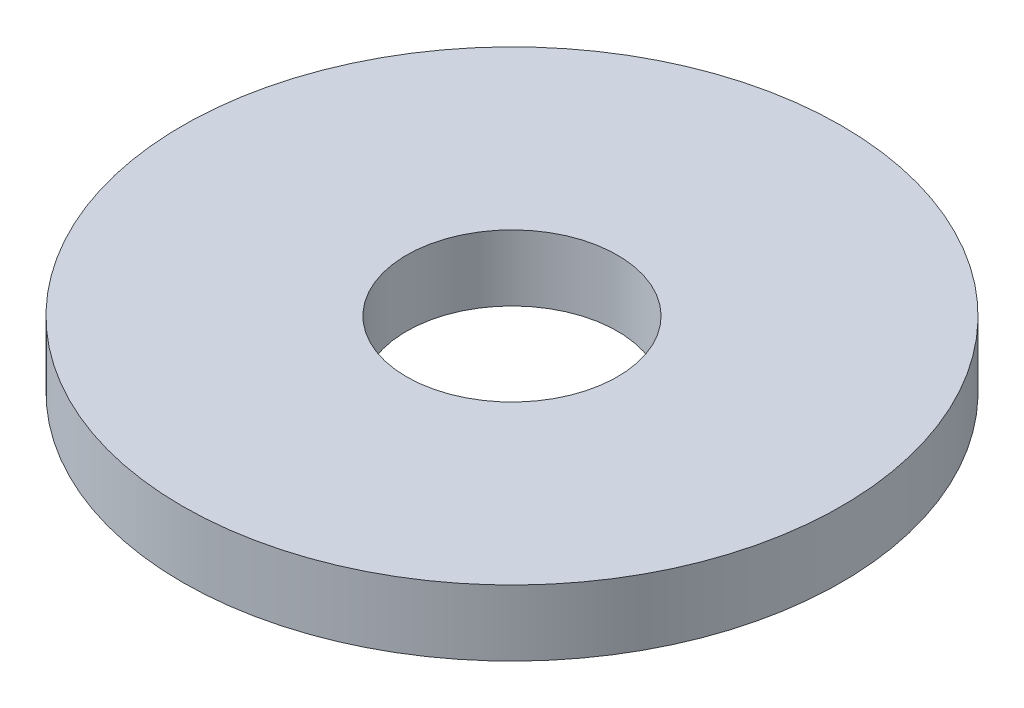
ISO-10303-21;
HEADER;
FILE_DESCRIPTION(('STEP AP214'),'2;1');
FILE_NAME('part.step','',(''),(''),'','','');
FILE_SCHEMA(('AUTOMOTIVE_DESIGN { 1 0 10303 214 1 1 1 1 }'));
ENDSEC;
DATA;
#1=APPLICATION_CONTEXT('core data for automotive mechanical design processes');
#2=APPLICATION_PROTOCOL_DEFINITION('international standard','automotive_design',2000,#1);
#3=PRODUCT_CONTEXT('',#1,'mechanical');
#4=PRODUCT('Part','Part','',(#3));
#5=PRODUCT_RELATED_PRODUCT_CATEGORY('part','',(#4));
#6=PRODUCT_DEFINITION_FORMATION('','',#4);
#7=PRODUCT_DEFINITION_CONTEXT('part definition',#1,'design');
#8=PRODUCT_DEFINITION('design','',#6,#7);
#9=PRODUCT_DEFINITION_SHAPE('','',#8);
#10=(LENGTH_UNIT() NAMED_UNIT(*) SI_UNIT(.MILLI.,.METRE.));
#11=(NAMED_UNIT(*) PLANE_ANGLE_UNIT() SI_UNIT($,.RADIAN.));
#12=(NAMED_UNIT(*) SI_UNIT($,.STERADIAN.) SOLID_ANGLE_UNIT());
#13=UNCERTAINTY_MEASURE_WITH_UNIT(LENGTH_MEASURE(1.E-05),#10,'distance_accuracy_value','');
#14=(GEOMETRIC_REPRESENTATION_CONTEXT(3) GLOBAL_UNCERTAINTY_ASSIGNED_CONTEXT((#13)) GLOBAL_UNIT_ASSIGNED_CONTEXT((#10,
#11,#12)) REPRESENTATION_CONTEXT('',''));
#15=CARTESIAN_POINT('',(0.,0.,0.));
#16=DIRECTION('',(0.,0.,1.));
#17=DIRECTION('',(1.,0.,0.));
#18=AXIS2_PLACEMENT_3D('',#15,#16,#17);
#19=CARTESIAN_POINT('',(0.,1.,0.));
#20=DIRECTION('',(0.,1.,0.));
#21=DIRECTION('',(0.,0.,1.));
#22=AXIS2_PLACEMENT_3D('',#19,#20,#21);
#23=PLANE('',#22);
#24=CARTESIAN_POINT('',(0.,1.,0.));
#25=DIRECTION('',(0.,1.,0.));
#26=DIRECTION('',(0.,0.,1.));
#27=AXIS2_PLACEMENT_3D('',#24,#25,#26);
#28=CIRCLE('',#27,5.);
#29=CARTESIAN_POINT('',(0.,1.,5.));
#30=VERTEX_POINT('',#29);
#31=EDGE_CURVE('E10',#30,#30,#28,.T.);
#32=ORIENTED_EDGE('',*,*,#31,.T.);
#33=EDGE_LOOP('',(#32));
#34=FACE_BOUND('',#33,.T.);
#35=CARTESIAN_POINT('',(0.,1.,0.));
#36=DIRECTION('',(0.,1.,0.));
#37=DIRECTION('',(0.,0.,1.));
#38=AXIS2_PLACEMENT_3D('',#35,#36,#37);
#39=CIRCLE('',#38,1.6);
#40=CARTESIAN_POINT('',(0.,1.,1.6));
#41=VERTEX_POINT('',#40);
#42=EDGE_CURVE('E56',#41,#41,#39,.T.);
#43=ORIENTED_EDGE('',*,*,#42,.F.);
#44=EDGE_LOOP('',(#43));
#45=FACE_BOUND('',#44,.T.);
#46=ADVANCED_FACE('F43',(#34,#45),#23,.T.);
#47=CARTESIAN_POINT('',(0.,0.,0.));
#48=DIRECTION('',(0.,1.,0.));
#49=DIRECTION('',(0.,0.,1.));
#50=AXIS2_PLACEMENT_3D('',#47,#48,#49);
#51=PLANE('',#50);
#52=CARTESIAN_POINT('',(0.,0.,0.));
#53=DIRECTION('',(0.,1.,0.));
#54=DIRECTION('',(0.,0.,1.));
#55=AXIS2_PLACEMENT_3D('',#52,#53,#54);
#56=CIRCLE('',#55,5.);
#57=CARTESIAN_POINT('',(0.,0.,5.));
#58=VERTEX_POINT('',#57);
#59=EDGE_CURVE('E47',#58,#58,#56,.T.);
#60=ORIENTED_EDGE('',*,*,#59,.F.);
#61=EDGE_LOOP('',(#60));
#62=FACE_BOUND('',#61,.T.);
#63=CARTESIAN_POINT('',(0.,0.,0.));
#64=DIRECTION('',(0.,1.,0.));
#65=DIRECTION('',(0.,0.,1.));
#66=AXIS2_PLACEMENT_3D('',#63,#64,#65);
#67=CIRCLE('',#66,1.6);
#68=CARTESIAN_POINT('',(0.,0.,1.6));
#69=VERTEX_POINT('',#68);
#70=EDGE_CURVE('E58',#69,#69,#67,.T.);
#71=ORIENTED_EDGE('',*,*,#70,.T.);
#72=EDGE_LOOP('',(#71));
#73=FACE_BOUND('',#72,.T.);
#74=ADVANCED_FACE('F70',(#62,#73),#51,.F.);
#75=CARTESIAN_POINT('',(0.,1.,0.));
#76=DIRECTION('',(0.,-1.,0.));
#77=DIRECTION('',(0.,0.,-1.));
#78=AXIS2_PLACEMENT_3D('',#75,#76,#77);
#79=CYLINDRICAL_SURFACE('',#78,5.);
#80=ORIENTED_EDGE('',*,*,#31,.F.);
#81=EDGE_LOOP('',(#80));
#82=FACE_BOUND('',#81,.T.);
#83=ORIENTED_EDGE('',*,*,#59,.T.);
#84=EDGE_LOOP('',(#83));
#85=FACE_BOUND('',#84,.T.);
#86=ADVANCED_FACE('F45',(#82,#85),#79,.T.);
#87=CARTESIAN_POINT('',(0.,1.,0.));
#88=DIRECTION('',(0.,-1.,0.));
#89=DIRECTION('',(0.,0.,-1.));
#90=AXIS2_PLACEMENT_3D('',#87,#88,#89);
#91=CYLINDRICAL_SURFACE('',#90,1.6);
#92=ORIENTED_EDGE('',*,*,#42,.T.);
#93=EDGE_LOOP('',(#92));
#94=FACE_BOUND('',#93,.T.);
#95=ORIENTED_EDGE('',*,*,#70,.F.);
#96=EDGE_LOOP('',(#95));
#97=FACE_BOUND('',#96,.T.);
#98=ADVANCED_FACE('F66',(#94,#97),#91,.F.);
#99=CLOSED_SHELL('',(#46,#74,#86,#98));
#100=MANIFOLD_SOLID_BREP('B2',#99);
#101=ADVANCED_BREP_SHAPE_REPRESENTATION('',(#18,#100),#14);
#102=SHAPE_DEFINITION_REPRESENTATION(#9,#101);
ENDSEC;
END-ISO-10303-21;
